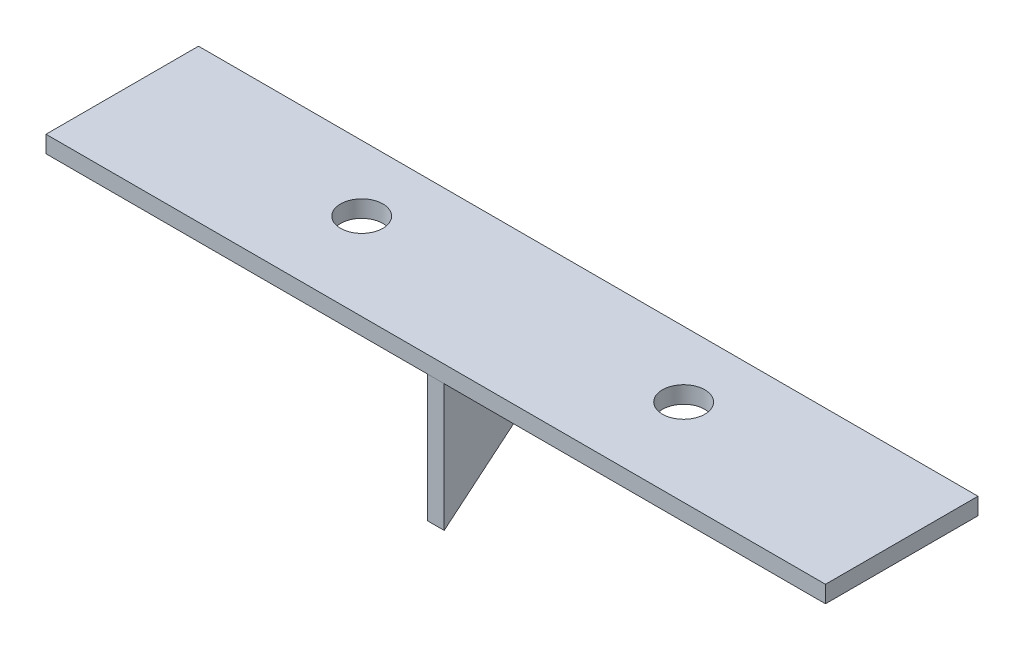
ISO-10303-21;
HEADER;
FILE_DESCRIPTION(('STEP AP214'),'2;1');
FILE_NAME('part.step','',(''),(''),'','','');
FILE_SCHEMA(('AUTOMOTIVE_DESIGN { 1 0 10303 214 1 1 1 1 }'));
ENDSEC;
DATA;
#1=APPLICATION_CONTEXT('core data for automotive mechanical design processes');
#2=APPLICATION_PROTOCOL_DEFINITION('international standard','automotive_design',2000,#1);
#3=PRODUCT_CONTEXT('',#1,'mechanical');
#4=PRODUCT('Part','Part','',(#3));
#5=PRODUCT_RELATED_PRODUCT_CATEGORY('part','',(#4));
#6=PRODUCT_DEFINITION_FORMATION('','',#4);
#7=PRODUCT_DEFINITION_CONTEXT('part definition',#1,'design');
#8=PRODUCT_DEFINITION('design','',#6,#7);
#9=PRODUCT_DEFINITION_SHAPE('','',#8);
#10=(LENGTH_UNIT() NAMED_UNIT(*) SI_UNIT(.MILLI.,.METRE.));
#11=(NAMED_UNIT(*) PLANE_ANGLE_UNIT() SI_UNIT($,.RADIAN.));
#12=(NAMED_UNIT(*) SI_UNIT($,.STERADIAN.) SOLID_ANGLE_UNIT());
#13=UNCERTAINTY_MEASURE_WITH_UNIT(LENGTH_MEASURE(1.E-05),#10,'distance_accuracy_value','');
#14=(GEOMETRIC_REPRESENTATION_CONTEXT(3) GLOBAL_UNCERTAINTY_ASSIGNED_CONTEXT((#13)) GLOBAL_UNIT_ASSIGNED_CONTEXT((#10,
#11,#12)) REPRESENTATION_CONTEXT('',''));
#15=CARTESIAN_POINT('',(0.,0.,0.));
#16=DIRECTION('',(0.,0.,1.));
#17=DIRECTION('',(1.,0.,0.));
#18=AXIS2_PLACEMENT_3D('',#15,#16,#17);
#19=CARTESIAN_POINT('',(1.,-2.,0.));
#20=DIRECTION('',(0.,-1.,0.));
#21=DIRECTION('',(0.,0.,-1.));
#22=AXIS2_PLACEMENT_3D('',#19,#20,#21);
#23=PLANE('',#22);
#24=DIRECTION('',(0.,0.,1.));
#25=VECTOR('',#24,1.);
#26=CARTESIAN_POINT('',(-1.,-2.,0.));
#27=LINE('',#26,#25);
#28=CARTESIAN_POINT('',(-1.,-2.,-17.9999999999999));
#29=VERTEX_POINT('',#28);
#30=CARTESIAN_POINT('',(-1.,-2.,0.));
#31=VERTEX_POINT('',#30);
#32=EDGE_CURVE('E96',#29,#31,#27,.T.);
#33=ORIENTED_EDGE('',*,*,#32,.T.);
#34=DIRECTION('',(-1.,0.,0.));
#35=VECTOR('',#34,1.);
#36=CARTESIAN_POINT('',(1.,-2.,0.));
#37=LINE('',#36,#35);
#38=CARTESIAN_POINT('',(1.,-2.,0.));
#39=VERTEX_POINT('',#38);
#40=EDGE_CURVE('E12',#39,#31,#37,.T.);
#41=ORIENTED_EDGE('',*,*,#40,.F.);
#42=DIRECTION('',(0.,0.,1.));
#43=VECTOR('',#42,1.);
#44=CARTESIAN_POINT('',(1.,-2.,0.));
#45=LINE('',#44,#43);
#46=CARTESIAN_POINT('',(1.,-2.,-17.9999999999999));
#47=VERTEX_POINT('',#46);
#48=EDGE_CURVE('E89',#47,#39,#45,.T.);
#49=ORIENTED_EDGE('',*,*,#48,.F.);
#50=DIRECTION('',(-1.,0.,0.));
#51=VECTOR('',#50,1.);
#52=CARTESIAN_POINT('',(1.,-2.,-17.9999999999999));
#53=LINE('',#52,#51);
#54=EDGE_CURVE('E97',#47,#29,#53,.T.);
#55=ORIENTED_EDGE('',*,*,#54,.T.);
#56=EDGE_LOOP('',(#33,#41,#49,#55));
#57=FACE_BOUND('',#56,.T.);
#58=ADVANCED_FACE('F49',(#57),#23,.F.);
#59=CARTESIAN_POINT('',(1.,-17.,0.));
#60=DIRECTION('',(0.,0.,-1.));
#61=DIRECTION('',(0.,1.,0.));
#62=AXIS2_PLACEMENT_3D('',#59,#60,#61);
#63=PLANE('',#62);
#64=DIRECTION('',(0.,-1.,0.));
#65=VECTOR('',#64,1.);
#66=CARTESIAN_POINT('',(-1.,-17.,0.));
#67=LINE('',#66,#65);
#68=CARTESIAN_POINT('',(-1.,-17.,0.));
#69=VERTEX_POINT('',#68);
#70=EDGE_CURVE('E77',#31,#69,#67,.T.);
#71=ORIENTED_EDGE('',*,*,#70,.T.);
#72=DIRECTION('',(-1.,0.,0.));
#73=VECTOR('',#72,1.);
#74=CARTESIAN_POINT('',(1.,-17.,0.));
#75=LINE('',#74,#73);
#76=CARTESIAN_POINT('',(1.,-17.,0.));
#77=VERTEX_POINT('',#76);
#78=EDGE_CURVE('E57',#77,#69,#75,.T.);
#79=ORIENTED_EDGE('',*,*,#78,.F.);
#80=DIRECTION('',(0.,-1.,0.));
#81=VECTOR('',#80,1.);
#82=CARTESIAN_POINT('',(1.,-17.,0.));
#83=LINE('',#82,#81);
#84=EDGE_CURVE('E85',#39,#77,#83,.T.);
#85=ORIENTED_EDGE('',*,*,#84,.F.);
#86=ORIENTED_EDGE('',*,*,#40,.T.);
#87=EDGE_LOOP('',(#71,#79,#85,#86));
#88=FACE_BOUND('',#87,.T.);
#89=ADVANCED_FACE('F86',(#88),#63,.F.);
#90=CARTESIAN_POINT('',(1.,-2.,-17.9999999999999));
#91=DIRECTION('',(0.,0.768221279597375,0.640184399664481));
#92=DIRECTION('',(0.,-0.640184399664481,0.768221279597375));
#93=AXIS2_PLACEMENT_3D('',#90,#91,#92);
#94=PLANE('',#93);
#95=DIRECTION('',(0.,0.640184399664481,-0.768221279597375));
#96=VECTOR('',#95,1.);
#97=CARTESIAN_POINT('',(-1.,-2.,-17.9999999999999));
#98=LINE('',#97,#96);
#99=EDGE_CURVE('E82',#69,#29,#98,.T.);
#100=ORIENTED_EDGE('',*,*,#99,.T.);
#101=ORIENTED_EDGE('',*,*,#54,.F.);
#102=DIRECTION('',(0.,0.640184399664481,-0.768221279597375));
#103=VECTOR('',#102,1.);
#104=CARTESIAN_POINT('',(1.,-2.,-17.9999999999999));
#105=LINE('',#104,#103);
#106=EDGE_CURVE('E65',#77,#47,#105,.T.);
#107=ORIENTED_EDGE('',*,*,#106,.F.);
#108=ORIENTED_EDGE('',*,*,#78,.T.);
#109=EDGE_LOOP('',(#100,#101,#107,#108));
#110=FACE_BOUND('',#109,.T.);
#111=ADVANCED_FACE('F104',(#110),#94,.F.);
#112=CARTESIAN_POINT('',(1.,0.,0.));
#113=DIRECTION('',(1.,0.,0.));
#114=DIRECTION('',(0.,0.,-1.));
#115=AXIS2_PLACEMENT_3D('',#112,#113,#114);
#116=PLANE('',#115);
#117=ORIENTED_EDGE('',*,*,#48,.T.);
#118=ORIENTED_EDGE('',*,*,#84,.T.);
#119=ORIENTED_EDGE('',*,*,#106,.T.);
#120=EDGE_LOOP('',(#117,#118,#119));
#121=FACE_BOUND('',#120,.T.);
#122=ADVANCED_FACE('F92',(#121),#116,.T.);
#123=CARTESIAN_POINT('',(-1.,0.,0.));
#124=DIRECTION('',(1.,0.,0.));
#125=DIRECTION('',(0.,0.,-1.));
#126=AXIS2_PLACEMENT_3D('',#123,#124,#125);
#127=PLANE('',#126);
#128=ORIENTED_EDGE('',*,*,#32,.F.);
#129=ORIENTED_EDGE('',*,*,#99,.F.);
#130=ORIENTED_EDGE('',*,*,#70,.F.);
#131=EDGE_LOOP('',(#128,#129,#130));
#132=FACE_BOUND('',#131,.T.);
#133=ADVANCED_FACE('F105',(#132),#127,.F.);
#134=CLOSED_SHELL('',(#58,#89,#111,#122,#133));
#135=MANIFOLD_SOLID_BREP('B2',#134);
#136=CARTESIAN_POINT('',(-46.,-2.,-18.));
#137=DIRECTION('',(0.,0.,-1.));
#138=DIRECTION('',(-1.,0.,0.));
#139=AXIS2_PLACEMENT_3D('',#136,#137,#138);
#140=PLANE('',#139);
#141=DIRECTION('',(-1.,0.,0.));
#142=VECTOR('',#141,1.);
#143=CARTESIAN_POINT('',(-46.,0.,-18.));
#144=LINE('',#143,#142);
#145=CARTESIAN_POINT('',(46.,0.,-17.9999999999999));
#146=VERTEX_POINT('',#145);
#147=CARTESIAN_POINT('',(-46.,0.,-18.));
#148=VERTEX_POINT('',#147);
#149=EDGE_CURVE('E212',#146,#148,#144,.T.);
#150=ORIENTED_EDGE('',*,*,#149,.F.);
#151=DIRECTION('',(0.,1.,0.));
#152=VECTOR('',#151,1.);
#153=CARTESIAN_POINT('',(46.,-2.,-17.9999999999999));
#154=LINE('',#153,#152);
#155=CARTESIAN_POINT('',(46.,-2.,-17.9999999999999));
#156=VERTEX_POINT('',#155);
#157=EDGE_CURVE('E47',#156,#146,#154,.T.);
#158=ORIENTED_EDGE('',*,*,#157,.F.);
#159=DIRECTION('',(-1.,0.,0.));
#160=VECTOR('',#159,1.);
#161=CARTESIAN_POINT('',(-46.,-2.,-18.));
#162=LINE('',#161,#160);
#163=CARTESIAN_POINT('',(-46.,-2.,-18.));
#164=VERTEX_POINT('',#163);
#165=EDGE_CURVE('E205',#156,#164,#162,.T.);
#166=ORIENTED_EDGE('',*,*,#165,.T.);
#167=DIRECTION('',(0.,1.,0.));
#168=VECTOR('',#167,1.);
#169=CARTESIAN_POINT('',(-46.,-2.,-18.));
#170=LINE('',#169,#168);
#171=EDGE_CURVE('E150',#164,#148,#170,.T.);
#172=ORIENTED_EDGE('',*,*,#171,.T.);
#173=EDGE_LOOP('',(#150,#158,#166,#172));
#174=FACE_BOUND('',#173,.T.);
#175=ADVANCED_FACE('F147',(#174),#140,.T.);
#176=CARTESIAN_POINT('',(46.,-2.,-17.9999999999999));
#177=DIRECTION('',(1.,0.,0.));
#178=DIRECTION('',(0.,0.,-1.));
#179=AXIS2_PLACEMENT_3D('',#176,#177,#178);
#180=PLANE('',#179);
#181=DIRECTION('',(0.,0.,-1.));
#182=VECTOR('',#181,1.);
#183=CARTESIAN_POINT('',(46.,0.,-17.9999999999999));
#184=LINE('',#183,#182);
#185=CARTESIAN_POINT('',(46.,0.,0.));
#186=VERTEX_POINT('',#185);
#187=EDGE_CURVE('E207',#186,#146,#184,.T.);
#188=ORIENTED_EDGE('',*,*,#187,.F.);
#189=DIRECTION('',(0.,1.,0.));
#190=VECTOR('',#189,1.);
#191=CARTESIAN_POINT('',(46.,-2.,0.));
#192=LINE('',#191,#190);
#193=CARTESIAN_POINT('',(46.,-2.,0.));
#194=VERTEX_POINT('',#193);
#195=EDGE_CURVE('E156',#194,#186,#192,.T.);
#196=ORIENTED_EDGE('',*,*,#195,.F.);
#197=DIRECTION('',(0.,0.,-1.));
#198=VECTOR('',#197,1.);
#199=CARTESIAN_POINT('',(46.,-2.,-17.9999999999999));
#200=LINE('',#199,#198);
#201=EDGE_CURVE('E202',#194,#156,#200,.T.);
#202=ORIENTED_EDGE('',*,*,#201,.T.);
#203=ORIENTED_EDGE('',*,*,#157,.T.);
#204=EDGE_LOOP('',(#188,#196,#202,#203));
#205=FACE_BOUND('',#204,.T.);
#206=ADVANCED_FACE('F223',(#205),#180,.T.);
#207=CARTESIAN_POINT('',(-46.,-2.,0.));
#208=DIRECTION('',(0.,0.,1.));
#209=DIRECTION('',(1.,0.,0.));
#210=AXIS2_PLACEMENT_3D('',#207,#208,#209);
#211=PLANE('',#210);
#212=DIRECTION('',(1.,0.,0.));
#213=VECTOR('',#212,1.);
#214=CARTESIAN_POINT('',(-46.,0.,0.));
#215=LINE('',#214,#213);
#216=CARTESIAN_POINT('',(-46.,0.,0.));
#217=VERTEX_POINT('',#216);
#218=EDGE_CURVE('E197',#217,#186,#215,.T.);
#219=ORIENTED_EDGE('',*,*,#218,.F.);
#220=DIRECTION('',(0.,1.,0.));
#221=VECTOR('',#220,1.);
#222=CARTESIAN_POINT('',(-46.,-2.,0.));
#223=LINE('',#222,#221);
#224=CARTESIAN_POINT('',(-46.,-2.,0.));
#225=VERTEX_POINT('',#224);
#226=EDGE_CURVE('E192',#225,#217,#223,.T.);
#227=ORIENTED_EDGE('',*,*,#226,.F.);
#228=DIRECTION('',(1.,0.,0.));
#229=VECTOR('',#228,1.);
#230=CARTESIAN_POINT('',(-46.,-2.,0.));
#231=LINE('',#230,#229);
#232=EDGE_CURVE('E195',#225,#194,#231,.T.);
#233=ORIENTED_EDGE('',*,*,#232,.T.);
#234=ORIENTED_EDGE('',*,*,#195,.T.);
#235=EDGE_LOOP('',(#219,#227,#233,#234));
#236=FACE_BOUND('',#235,.T.);
#237=ADVANCED_FACE('F194',(#236),#211,.T.);
#238=CARTESIAN_POINT('',(-46.,-2.,-18.));
#239=DIRECTION('',(-1.,0.,0.));
#240=DIRECTION('',(0.,0.,1.));
#241=AXIS2_PLACEMENT_3D('',#238,#239,#240);
#242=PLANE('',#241);
#243=DIRECTION('',(0.,0.,1.));
#244=VECTOR('',#243,1.);
#245=CARTESIAN_POINT('',(-46.,0.,-18.));
#246=LINE('',#245,#244);
#247=EDGE_CURVE('E215',#148,#217,#246,.T.);
#248=ORIENTED_EDGE('',*,*,#247,.F.);
#249=ORIENTED_EDGE('',*,*,#171,.F.);
#250=DIRECTION('',(0.,0.,1.));
#251=VECTOR('',#250,1.);
#252=CARTESIAN_POINT('',(-46.,-2.,-18.));
#253=LINE('',#252,#251);
#254=EDGE_CURVE('E201',#164,#225,#253,.T.);
#255=ORIENTED_EDGE('',*,*,#254,.T.);
#256=ORIENTED_EDGE('',*,*,#226,.T.);
#257=EDGE_LOOP('',(#248,#249,#255,#256));
#258=FACE_BOUND('',#257,.T.);
#259=ADVANCED_FACE('F204',(#258),#242,.T.);
#260=CARTESIAN_POINT('',(0.,-2.,0.));
#261=DIRECTION('',(0.,-1.,0.));
#262=DIRECTION('',(0.,0.,-1.));
#263=AXIS2_PLACEMENT_3D('',#260,#261,#262);
#264=PLANE('',#263);
#265=CARTESIAN_POINT('',(-19.,-2.,-10.26));
#266=DIRECTION('',(0.,-1.,0.));
#267=DIRECTION('',(0.,0.,-1.));
#268=AXIS2_PLACEMENT_3D('',#265,#266,#267);
#269=CIRCLE('',#268,2.5);
#270=CARTESIAN_POINT('',(-19.,-2.,-12.76));
#271=VERTEX_POINT('',#270);
#272=EDGE_CURVE('E216',#271,#271,#269,.T.);
#273=ORIENTED_EDGE('',*,*,#272,.F.);
#274=EDGE_LOOP('',(#273));
#275=FACE_BOUND('',#274,.T.);
#276=CARTESIAN_POINT('',(19.,-2.,-10.26));
#277=DIRECTION('',(0.,-1.,0.));
#278=DIRECTION('',(0.,0.,-1.));
#279=AXIS2_PLACEMENT_3D('',#276,#277,#278);
#280=CIRCLE('',#279,2.5);
#281=CARTESIAN_POINT('',(19.,-2.,-12.76));
#282=VERTEX_POINT('',#281);
#283=EDGE_CURVE('E259',#282,#282,#280,.T.);
#284=ORIENTED_EDGE('',*,*,#283,.F.);
#285=EDGE_LOOP('',(#284));
#286=FACE_BOUND('',#285,.T.);
#287=ORIENTED_EDGE('',*,*,#165,.F.);
#288=ORIENTED_EDGE('',*,*,#201,.F.);
#289=ORIENTED_EDGE('',*,*,#232,.F.);
#290=ORIENTED_EDGE('',*,*,#254,.F.);
#291=EDGE_LOOP('',(#287,#288,#289,#290));
#292=FACE_BOUND('',#291,.T.);
#293=ADVANCED_FACE('F200',(#275,#286,#292),#264,.T.);
#294=CARTESIAN_POINT('',(0.,0.,0.));
#295=DIRECTION('',(0.,-1.,0.));
#296=DIRECTION('',(0.,0.,-1.));
#297=AXIS2_PLACEMENT_3D('',#294,#295,#296);
#298=PLANE('',#297);
#299=CARTESIAN_POINT('',(-19.,0.,-10.26));
#300=DIRECTION('',(0.,1.,0.));
#301=DIRECTION('',(0.,0.,1.));
#302=AXIS2_PLACEMENT_3D('',#299,#300,#301);
#303=CIRCLE('',#302,2.5);
#304=CARTESIAN_POINT('',(-19.,0.,-7.75999999999997));
#305=VERTEX_POINT('',#304);
#306=EDGE_CURVE('E258',#305,#305,#303,.T.);
#307=ORIENTED_EDGE('',*,*,#306,.F.);
#308=EDGE_LOOP('',(#307));
#309=FACE_BOUND('',#308,.T.);
#310=CARTESIAN_POINT('',(19.,0.,-10.26));
#311=DIRECTION('',(0.,1.,0.));
#312=DIRECTION('',(0.,0.,-1.));
#313=AXIS2_PLACEMENT_3D('',#310,#311,#312);
#314=CIRCLE('',#313,2.5);
#315=CARTESIAN_POINT('',(19.,0.,-12.76));
#316=VERTEX_POINT('',#315);
#317=EDGE_CURVE('E260',#316,#316,#314,.T.);
#318=ORIENTED_EDGE('',*,*,#317,.F.);
#319=EDGE_LOOP('',(#318));
#320=FACE_BOUND('',#319,.T.);
#321=ORIENTED_EDGE('',*,*,#149,.T.);
#322=ORIENTED_EDGE('',*,*,#247,.T.);
#323=ORIENTED_EDGE('',*,*,#218,.T.);
#324=ORIENTED_EDGE('',*,*,#187,.T.);
#325=EDGE_LOOP('',(#321,#322,#323,#324));
#326=FACE_BOUND('',#325,.T.);
#327=ADVANCED_FACE('F222',(#309,#320,#326),#298,.F.);
#328=CARTESIAN_POINT('',(19.,-10.,-10.26));
#329=DIRECTION('',(0.,1.,0.));
#330=DIRECTION('',(0.,0.,1.));
#331=AXIS2_PLACEMENT_3D('',#328,#329,#330);
#332=CYLINDRICAL_SURFACE('',#331,2.5);
#333=ORIENTED_EDGE('',*,*,#283,.T.);
#334=EDGE_LOOP('',(#333));
#335=FACE_BOUND('',#334,.T.);
#336=ORIENTED_EDGE('',*,*,#317,.T.);
#337=EDGE_LOOP('',(#336));
#338=FACE_BOUND('',#337,.T.);
#339=ADVANCED_FACE('F241',(#335,#338),#332,.F.);
#340=CARTESIAN_POINT('',(-19.,-10.,-10.26));
#341=DIRECTION('',(0.,1.,0.));
#342=DIRECTION('',(0.,0.,1.));
#343=AXIS2_PLACEMENT_3D('',#340,#341,#342);
#344=CYLINDRICAL_SURFACE('',#343,2.5);
#345=ORIENTED_EDGE('',*,*,#272,.T.);
#346=EDGE_LOOP('',(#345));
#347=FACE_BOUND('',#346,.T.);
#348=ORIENTED_EDGE('',*,*,#306,.T.);
#349=EDGE_LOOP('',(#348));
#350=FACE_BOUND('',#349,.T.);
#351=ADVANCED_FACE('F248',(#347,#350),#344,.F.);
#352=CLOSED_SHELL('',(#175,#206,#237,#259,#293,#327,#339,#351));
#353=MANIFOLD_SOLID_BREP('B6',#352);
#354=ADVANCED_BREP_SHAPE_REPRESENTATION('',(#18,#135,#353),#14);
#355=SHAPE_DEFINITION_REPRESENTATION(#9,#354);
ENDSEC;
END-ISO-10303-21;
